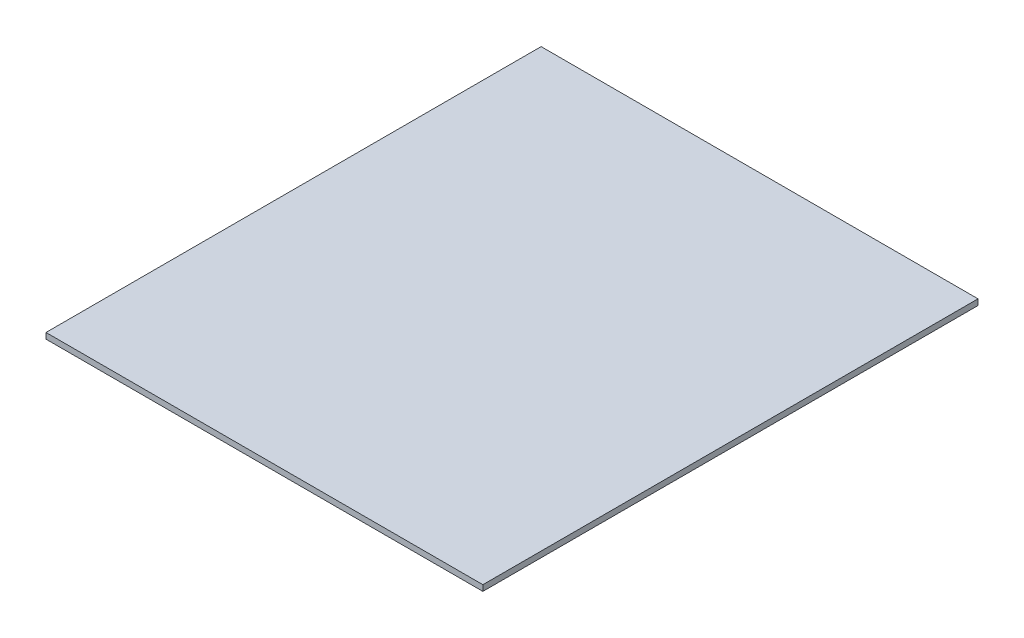
ISO-10303-21;
HEADER;
FILE_DESCRIPTION(('STEP AP214'),'2;1');
FILE_NAME('part.step','',(''),(''),'','','');
FILE_SCHEMA(('AUTOMOTIVE_DESIGN { 1 0 10303 214 1 1 1 1 }'));
ENDSEC;
DATA;
#1=APPLICATION_CONTEXT('core data for automotive mechanical design processes');
#2=APPLICATION_PROTOCOL_DEFINITION('international standard','automotive_design',2000,#1);
#3=PRODUCT_CONTEXT('',#1,'mechanical');
#4=PRODUCT('Part','Part','',(#3));
#5=PRODUCT_RELATED_PRODUCT_CATEGORY('part','',(#4));
#6=PRODUCT_DEFINITION_FORMATION('','',#4);
#7=PRODUCT_DEFINITION_CONTEXT('part definition',#1,'design');
#8=PRODUCT_DEFINITION('design','',#6,#7);
#9=PRODUCT_DEFINITION_SHAPE('','',#8);
#10=(LENGTH_UNIT() NAMED_UNIT(*) SI_UNIT(.MILLI.,.METRE.));
#11=(NAMED_UNIT(*) PLANE_ANGLE_UNIT() SI_UNIT($,.RADIAN.));
#12=(NAMED_UNIT(*) SI_UNIT($,.STERADIAN.) SOLID_ANGLE_UNIT());
#13=UNCERTAINTY_MEASURE_WITH_UNIT(LENGTH_MEASURE(1.E-05),#10,'distance_accuracy_value','');
#14=(GEOMETRIC_REPRESENTATION_CONTEXT(3) GLOBAL_UNCERTAINTY_ASSIGNED_CONTEXT((#13)) GLOBAL_UNIT_ASSIGNED_CONTEXT((#10,
#11,#12)) REPRESENTATION_CONTEXT('',''));
#15=CARTESIAN_POINT('',(0.,0.,0.));
#16=DIRECTION('',(0.,0.,1.));
#17=DIRECTION('',(1.,0.,0.));
#18=AXIS2_PLACEMENT_3D('',#15,#16,#17);
#19=CARTESIAN_POINT('',(-70.209431823173,2.,105.463013804963));
#20=DIRECTION('',(1.,0.,0.));
#21=DIRECTION('',(0.,0.,-1.));
#22=AXIS2_PLACEMENT_3D('',#19,#20,#21);
#23=PLANE('',#22);
#24=DIRECTION('',(0.,0.,1.));
#25=VECTOR('',#24,1.);
#26=CARTESIAN_POINT('',(-70.209431823173,0.,105.463013804963));
#27=LINE('',#26,#25);
#28=CARTESIAN_POINT('',(-70.209431823173,0.,-64.5369861950371));
#29=VERTEX_POINT('',#28);
#30=CARTESIAN_POINT('',(-70.209431823173,0.,105.463013804963));
#31=VERTEX_POINT('',#30);
#32=EDGE_CURVE('E96',#29,#31,#27,.T.);
#33=ORIENTED_EDGE('',*,*,#32,.T.);
#34=DIRECTION('',(0.,-1.,0.));
#35=VECTOR('',#34,1.);
#36=CARTESIAN_POINT('',(-70.209431823173,2.,105.463013804963));
#37=LINE('',#36,#35);
#38=CARTESIAN_POINT('',(-70.209431823173,2.,105.463013804963));
#39=VERTEX_POINT('',#38);
#40=EDGE_CURVE('E11',#39,#31,#37,.T.);
#41=ORIENTED_EDGE('',*,*,#40,.F.);
#42=DIRECTION('',(0.,0.,1.));
#43=VECTOR('',#42,1.);
#44=CARTESIAN_POINT('',(-70.209431823173,2.,105.463013804963));
#45=LINE('',#44,#43);
#46=CARTESIAN_POINT('',(-70.209431823173,2.,-64.5369861950371));
#47=VERTEX_POINT('',#46);
#48=EDGE_CURVE('E84',#47,#39,#45,.T.);
#49=ORIENTED_EDGE('',*,*,#48,.F.);
#50=DIRECTION('',(0.,-1.,0.));
#51=VECTOR('',#50,1.);
#52=CARTESIAN_POINT('',(-70.209431823173,2.,-64.5369861950371));
#53=LINE('',#52,#51);
#54=EDGE_CURVE('E92',#47,#29,#53,.T.);
#55=ORIENTED_EDGE('',*,*,#54,.T.);
#56=EDGE_LOOP('',(#33,#41,#49,#55));
#57=FACE_BOUND('',#56,.T.);
#58=ADVANCED_FACE('F33',(#57),#23,.F.);
#59=CARTESIAN_POINT('',(-70.209431823173,2.,105.463013804963));
#60=DIRECTION('',(0.,0.,-1.));
#61=DIRECTION('',(-1.,0.,0.));
#62=AXIS2_PLACEMENT_3D('',#59,#60,#61);
#63=PLANE('',#62);
#64=DIRECTION('',(1.,0.,0.));
#65=VECTOR('',#64,1.);
#66=CARTESIAN_POINT('',(-70.209431823173,0.,105.463013804963));
#67=LINE('',#66,#65);
#68=CARTESIAN_POINT('',(79.790568176827,0.,105.463013804963));
#69=VERTEX_POINT('',#68);
#70=EDGE_CURVE('E88',#31,#69,#67,.T.);
#71=ORIENTED_EDGE('',*,*,#70,.T.);
#72=DIRECTION('',(0.,-1.,0.));
#73=VECTOR('',#72,1.);
#74=CARTESIAN_POINT('',(79.790568176827,2.,105.463013804963));
#75=LINE('',#74,#73);
#76=CARTESIAN_POINT('',(79.790568176827,2.,105.463013804963));
#77=VERTEX_POINT('',#76);
#78=EDGE_CURVE('E41',#77,#69,#75,.T.);
#79=ORIENTED_EDGE('',*,*,#78,.F.);
#80=DIRECTION('',(1.,0.,0.));
#81=VECTOR('',#80,1.);
#82=CARTESIAN_POINT('',(-70.209431823173,2.,105.463013804963));
#83=LINE('',#82,#81);
#84=EDGE_CURVE('E79',#39,#77,#83,.T.);
#85=ORIENTED_EDGE('',*,*,#84,.F.);
#86=ORIENTED_EDGE('',*,*,#40,.T.);
#87=EDGE_LOOP('',(#71,#79,#85,#86));
#88=FACE_BOUND('',#87,.T.);
#89=ADVANCED_FACE('F87',(#88),#63,.F.);
#90=CARTESIAN_POINT('',(79.790568176827,2.,105.463013804963));
#91=DIRECTION('',(-1.,0.,0.));
#92=DIRECTION('',(0.,0.,1.));
#93=AXIS2_PLACEMENT_3D('',#90,#91,#92);
#94=PLANE('',#93);
#95=DIRECTION('',(0.,0.,-1.));
#96=VECTOR('',#95,1.);
#97=CARTESIAN_POINT('',(79.790568176827,0.,105.463013804963));
#98=LINE('',#97,#96);
#99=CARTESIAN_POINT('',(79.790568176827,0.,-64.5369861950371));
#100=VERTEX_POINT('',#99);
#101=EDGE_CURVE('E66',#69,#100,#98,.T.);
#102=ORIENTED_EDGE('',*,*,#101,.T.);
#103=DIRECTION('',(0.,-1.,0.));
#104=VECTOR('',#103,1.);
#105=CARTESIAN_POINT('',(79.790568176827,2.,-64.5369861950371));
#106=LINE('',#105,#104);
#107=CARTESIAN_POINT('',(79.790568176827,2.,-64.5369861950371));
#108=VERTEX_POINT('',#107);
#109=EDGE_CURVE('E89',#108,#100,#106,.T.);
#110=ORIENTED_EDGE('',*,*,#109,.F.);
#111=DIRECTION('',(0.,0.,-1.));
#112=VECTOR('',#111,1.);
#113=CARTESIAN_POINT('',(79.790568176827,2.,105.463013804963));
#114=LINE('',#113,#112);
#115=EDGE_CURVE('E82',#77,#108,#114,.T.);
#116=ORIENTED_EDGE('',*,*,#115,.F.);
#117=ORIENTED_EDGE('',*,*,#78,.T.);
#118=EDGE_LOOP('',(#102,#110,#116,#117));
#119=FACE_BOUND('',#118,.T.);
#120=ADVANCED_FACE('F90',(#119),#94,.F.);
#121=CARTESIAN_POINT('',(-70.209431823173,2.,-64.5369861950371));
#122=DIRECTION('',(0.,0.,1.));
#123=DIRECTION('',(1.,0.,0.));
#124=AXIS2_PLACEMENT_3D('',#121,#122,#123);
#125=PLANE('',#124);
#126=DIRECTION('',(-1.,0.,0.));
#127=VECTOR('',#126,1.);
#128=CARTESIAN_POINT('',(-70.209431823173,0.,-64.5369861950371));
#129=LINE('',#128,#127);
#130=EDGE_CURVE('E72',#100,#29,#129,.T.);
#131=ORIENTED_EDGE('',*,*,#130,.T.);
#132=ORIENTED_EDGE('',*,*,#54,.F.);
#133=DIRECTION('',(-1.,0.,0.));
#134=VECTOR('',#133,1.);
#135=CARTESIAN_POINT('',(-70.209431823173,2.,-64.5369861950371));
#136=LINE('',#135,#134);
#137=EDGE_CURVE('E49',#108,#47,#136,.T.);
#138=ORIENTED_EDGE('',*,*,#137,.F.);
#139=ORIENTED_EDGE('',*,*,#109,.T.);
#140=EDGE_LOOP('',(#131,#132,#138,#139));
#141=FACE_BOUND('',#140,.T.);
#142=ADVANCED_FACE('F103',(#141),#125,.F.);
#143=CARTESIAN_POINT('',(0.,2.,0.));
#144=DIRECTION('',(0.,-1.,0.));
#145=DIRECTION('',(0.,0.,-1.));
#146=AXIS2_PLACEMENT_3D('',#143,#144,#145);
#147=PLANE('',#146);
#148=ORIENTED_EDGE('',*,*,#48,.T.);
#149=ORIENTED_EDGE('',*,*,#84,.T.);
#150=ORIENTED_EDGE('',*,*,#115,.T.);
#151=ORIENTED_EDGE('',*,*,#137,.T.);
#152=EDGE_LOOP('',(#148,#149,#150,#151));
#153=FACE_BOUND('',#152,.T.);
#154=ADVANCED_FACE('F80',(#153),#147,.F.);
#155=CARTESIAN_POINT('',(0.,0.,0.));
#156=DIRECTION('',(0.,-1.,0.));
#157=DIRECTION('',(0.,0.,-1.));
#158=AXIS2_PLACEMENT_3D('',#155,#156,#157);
#159=PLANE('',#158);
#160=ORIENTED_EDGE('',*,*,#32,.F.);
#161=ORIENTED_EDGE('',*,*,#130,.F.);
#162=ORIENTED_EDGE('',*,*,#101,.F.);
#163=ORIENTED_EDGE('',*,*,#70,.F.);
#164=EDGE_LOOP('',(#160,#161,#162,#163));
#165=FACE_BOUND('',#164,.T.);
#166=ADVANCED_FACE('F106',(#165),#159,.T.);
#167=CLOSED_SHELL('',(#58,#89,#120,#142,#154,#166));
#168=MANIFOLD_SOLID_BREP('B2',#167);
#169=ADVANCED_BREP_SHAPE_REPRESENTATION('',(#18,#168),#14);
#170=SHAPE_DEFINITION_REPRESENTATION(#9,#169);
ENDSEC;
END-ISO-10303-21;
